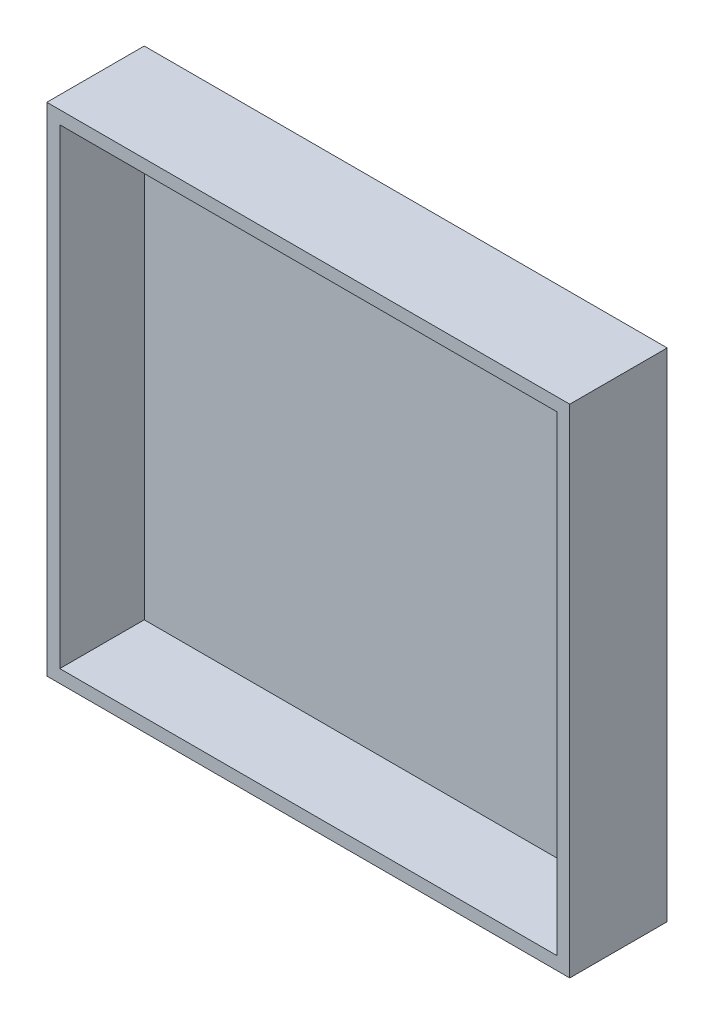
ISO-10303-21;
HEADER;
FILE_DESCRIPTION(('STEP AP214'),'2;1');
FILE_NAME('part.step','',(''),(''),'','','');
FILE_SCHEMA(('AUTOMOTIVE_DESIGN { 1 0 10303 214 1 1 1 1 }'));
ENDSEC;
DATA;
#1=APPLICATION_CONTEXT('core data for automotive mechanical design processes');
#2=APPLICATION_PROTOCOL_DEFINITION('international standard','automotive_design',2000,#1);
#3=PRODUCT_CONTEXT('',#1,'mechanical');
#4=PRODUCT('Part','Part','',(#3));
#5=PRODUCT_RELATED_PRODUCT_CATEGORY('part','',(#4));
#6=PRODUCT_DEFINITION_FORMATION('','',#4);
#7=PRODUCT_DEFINITION_CONTEXT('part definition',#1,'design');
#8=PRODUCT_DEFINITION('design','',#6,#7);
#9=PRODUCT_DEFINITION_SHAPE('','',#8);
#10=(LENGTH_UNIT() NAMED_UNIT(*) SI_UNIT(.MILLI.,.METRE.));
#11=(NAMED_UNIT(*) PLANE_ANGLE_UNIT() SI_UNIT($,.RADIAN.));
#12=(NAMED_UNIT(*) SI_UNIT($,.STERADIAN.) SOLID_ANGLE_UNIT());
#13=UNCERTAINTY_MEASURE_WITH_UNIT(LENGTH_MEASURE(1.E-05),#10,'distance_accuracy_value','');
#14=(GEOMETRIC_REPRESENTATION_CONTEXT(3) GLOBAL_UNCERTAINTY_ASSIGNED_CONTEXT((#13)) GLOBAL_UNIT_ASSIGNED_CONTEXT((#10,
#11,#12)) REPRESENTATION_CONTEXT('',''));
#15=CARTESIAN_POINT('',(0.,0.,0.));
#16=DIRECTION('',(0.,0.,1.));
#17=DIRECTION('',(1.,0.,0.));
#18=AXIS2_PLACEMENT_3D('',#15,#16,#17);
#19=CARTESIAN_POINT('',(-70.1385934908362,46.5557607090103,2.));
#20=DIRECTION('',(1.,0.,0.));
#21=DIRECTION('',(0.,1.,0.));
#22=AXIS2_PLACEMENT_3D('',#19,#20,#21);
#23=PLANE('',#22);
#24=DIRECTION('',(0.,-1.,0.));
#25=VECTOR('',#24,1.);
#26=CARTESIAN_POINT('',(-70.1385934908362,46.5557607090103,0.));
#27=LINE('',#26,#25);
#28=CARTESIAN_POINT('',(-70.1385934908362,46.5557607090103,0.));
#29=VERTEX_POINT('',#28);
#30=CARTESIAN_POINT('',(-70.1385934908361,-29.9442392909897,0.));
#31=VERTEX_POINT('',#30);
#32=EDGE_CURVE('E146',#29,#31,#27,.T.);
#33=ORIENTED_EDGE('',*,*,#32,.T.);
#34=DIRECTION('',(0.,0.,-1.));
#35=VECTOR('',#34,1.);
#36=CARTESIAN_POINT('',(-70.1385934908361,-29.9442392909897,2.));
#37=LINE('',#36,#35);
#38=CARTESIAN_POINT('',(-70.1385934908362,-29.9442392909897,15.));
#39=VERTEX_POINT('',#38);
#40=EDGE_CURVE('E11',#39,#31,#37,.T.);
#41=ORIENTED_EDGE('',*,*,#40,.F.);
#42=DIRECTION('',(0.,-1.,0.));
#43=VECTOR('',#42,1.);
#44=CARTESIAN_POINT('',(-70.1385934908362,46.5557607090103,15.));
#45=LINE('',#44,#43);
#46=CARTESIAN_POINT('',(-70.1385934908362,46.5557607090103,15.));
#47=VERTEX_POINT('',#46);
#48=EDGE_CURVE('E113',#47,#39,#45,.T.);
#49=ORIENTED_EDGE('',*,*,#48,.F.);
#50=DIRECTION('',(0.,0.,-1.));
#51=VECTOR('',#50,1.);
#52=CARTESIAN_POINT('',(-70.1385934908362,46.5557607090103,2.));
#53=LINE('',#52,#51);
#54=EDGE_CURVE('E155',#47,#29,#53,.T.);
#55=ORIENTED_EDGE('',*,*,#54,.T.);
#56=EDGE_LOOP('',(#33,#41,#49,#55));
#57=FACE_BOUND('',#56,.T.);
#58=ADVANCED_FACE('F35',(#57),#23,.F.);
#59=CARTESIAN_POINT('',(-70.1385934908361,-29.9442392909897,2.));
#60=DIRECTION('',(0.,1.,0.));
#61=DIRECTION('',(0.,0.,1.));
#62=AXIS2_PLACEMENT_3D('',#59,#60,#61);
#63=PLANE('',#62);
#64=DIRECTION('',(1.,0.,0.));
#65=VECTOR('',#64,1.);
#66=CARTESIAN_POINT('',(-70.1385934908361,-29.9442392909897,0.));
#67=LINE('',#66,#65);
#68=CARTESIAN_POINT('',(10.3614065091638,-29.9442392909897,0.));
#69=VERTEX_POINT('',#68);
#70=EDGE_CURVE('E149',#31,#69,#67,.T.);
#71=ORIENTED_EDGE('',*,*,#70,.T.);
#72=DIRECTION('',(0.,0.,-1.));
#73=VECTOR('',#72,1.);
#74=CARTESIAN_POINT('',(10.3614065091638,-29.9442392909897,2.));
#75=LINE('',#74,#73);
#76=CARTESIAN_POINT('',(10.3614065091638,-29.9442392909897,15.));
#77=VERTEX_POINT('',#76);
#78=EDGE_CURVE('E42',#77,#69,#75,.T.);
#79=ORIENTED_EDGE('',*,*,#78,.F.);
#80=DIRECTION('',(1.,0.,0.));
#81=VECTOR('',#80,1.);
#82=CARTESIAN_POINT('',(-70.1385934908362,-29.9442392909897,15.));
#83=LINE('',#82,#81);
#84=EDGE_CURVE('E137',#39,#77,#83,.T.);
#85=ORIENTED_EDGE('',*,*,#84,.F.);
#86=ORIENTED_EDGE('',*,*,#40,.T.);
#87=EDGE_LOOP('',(#71,#79,#85,#86));
#88=FACE_BOUND('',#87,.T.);
#89=ADVANCED_FACE('F177',(#88),#63,.F.);
#90=CARTESIAN_POINT('',(10.3614065091638,46.5557607090103,2.));
#91=DIRECTION('',(-1.,0.,0.));
#92=DIRECTION('',(0.,-1.,0.));
#93=AXIS2_PLACEMENT_3D('',#90,#91,#92);
#94=PLANE('',#93);
#95=DIRECTION('',(0.,1.,0.));
#96=VECTOR('',#95,1.);
#97=CARTESIAN_POINT('',(10.3614065091638,46.5557607090103,0.));
#98=LINE('',#97,#96);
#99=CARTESIAN_POINT('',(10.3614065091638,46.5557607090103,0.));
#100=VERTEX_POINT('',#99);
#101=EDGE_CURVE('E151',#69,#100,#98,.T.);
#102=ORIENTED_EDGE('',*,*,#101,.T.);
#103=DIRECTION('',(0.,0.,-1.));
#104=VECTOR('',#103,1.);
#105=CARTESIAN_POINT('',(10.3614065091638,46.5557607090103,2.));
#106=LINE('',#105,#104);
#107=CARTESIAN_POINT('',(10.3614065091638,46.5557607090103,15.));
#108=VERTEX_POINT('',#107);
#109=EDGE_CURVE('E158',#108,#100,#106,.T.);
#110=ORIENTED_EDGE('',*,*,#109,.F.);
#111=DIRECTION('',(0.,1.,0.));
#112=VECTOR('',#111,1.);
#113=CARTESIAN_POINT('',(10.3614065091638,46.5557607090103,15.));
#114=LINE('',#113,#112);
#115=EDGE_CURVE('E140',#77,#108,#114,.T.);
#116=ORIENTED_EDGE('',*,*,#115,.F.);
#117=ORIENTED_EDGE('',*,*,#78,.T.);
#118=EDGE_LOOP('',(#102,#110,#116,#117));
#119=FACE_BOUND('',#118,.T.);
#120=ADVANCED_FACE('F164',(#119),#94,.F.);
#121=CARTESIAN_POINT('',(-70.1385934908362,46.5557607090103,2.));
#122=DIRECTION('',(0.,-1.,0.));
#123=DIRECTION('',(0.,0.,-1.));
#124=AXIS2_PLACEMENT_3D('',#121,#122,#123);
#125=PLANE('',#124);
#126=DIRECTION('',(-1.,0.,0.));
#127=VECTOR('',#126,1.);
#128=CARTESIAN_POINT('',(-70.1385934908362,46.5557607090103,0.));
#129=LINE('',#128,#127);
#130=EDGE_CURVE('E153',#100,#29,#129,.T.);
#131=ORIENTED_EDGE('',*,*,#130,.T.);
#132=ORIENTED_EDGE('',*,*,#54,.F.);
#133=DIRECTION('',(-1.,0.,0.));
#134=VECTOR('',#133,1.);
#135=CARTESIAN_POINT('',(-70.1385934908362,46.5557607090103,15.));
#136=LINE('',#135,#134);
#137=EDGE_CURVE('E143',#108,#47,#136,.T.);
#138=ORIENTED_EDGE('',*,*,#137,.F.);
#139=ORIENTED_EDGE('',*,*,#109,.T.);
#140=EDGE_LOOP('',(#131,#132,#138,#139));
#141=FACE_BOUND('',#140,.T.);
#142=ADVANCED_FACE('F172',(#141),#125,.F.);
#143=CARTESIAN_POINT('',(0.,0.,0.));
#144=DIRECTION('',(0.,0.,1.));
#145=DIRECTION('',(1.,0.,0.));
#146=AXIS2_PLACEMENT_3D('',#143,#144,#145);
#147=PLANE('',#146);
#148=ORIENTED_EDGE('',*,*,#32,.F.);
#149=ORIENTED_EDGE('',*,*,#130,.F.);
#150=ORIENTED_EDGE('',*,*,#101,.F.);
#151=ORIENTED_EDGE('',*,*,#70,.F.);
#152=EDGE_LOOP('',(#148,#149,#150,#151));
#153=FACE_BOUND('',#152,.T.);
#154=ADVANCED_FACE('F170',(#153),#147,.F.);
#155=CARTESIAN_POINT('',(0.,0.,15.));
#156=DIRECTION('',(0.,0.,1.));
#157=DIRECTION('',(1.,0.,0.));
#158=AXIS2_PLACEMENT_3D('',#155,#156,#157);
#159=PLANE('',#158);
#160=ORIENTED_EDGE('',*,*,#48,.T.);
#161=ORIENTED_EDGE('',*,*,#84,.T.);
#162=ORIENTED_EDGE('',*,*,#115,.T.);
#163=ORIENTED_EDGE('',*,*,#137,.T.);
#164=EDGE_LOOP('',(#160,#161,#162,#163));
#165=FACE_BOUND('',#164,.T.);
#166=DIRECTION('',(1.,0.,0.));
#167=VECTOR('',#166,1.);
#168=CARTESIAN_POINT('',(-68.1385934908362,-27.9442392909897,15.));
#169=LINE('',#168,#167);
#170=CARTESIAN_POINT('',(-68.1385934908362,-27.9442392909897,15.));
#171=VERTEX_POINT('',#170);
#172=CARTESIAN_POINT('',(8.36140650916384,-27.9442392909897,15.));
#173=VERTEX_POINT('',#172);
#174=EDGE_CURVE('E107',#171,#173,#169,.T.);
#175=ORIENTED_EDGE('',*,*,#174,.F.);
#176=DIRECTION('',(0.,-1.,0.));
#177=VECTOR('',#176,1.);
#178=CARTESIAN_POINT('',(-68.1385934908362,44.5557607090103,15.));
#179=LINE('',#178,#177);
#180=CARTESIAN_POINT('',(-68.1385934908362,44.5557607090103,15.));
#181=VERTEX_POINT('',#180);
#182=EDGE_CURVE('E98',#181,#171,#179,.T.);
#183=ORIENTED_EDGE('',*,*,#182,.F.);
#184=DIRECTION('',(-1.,0.,0.));
#185=VECTOR('',#184,1.);
#186=CARTESIAN_POINT('',(-68.1385934908362,44.5557607090103,15.));
#187=LINE('',#186,#185);
#188=CARTESIAN_POINT('',(8.36140650916383,44.5557607090103,15.));
#189=VERTEX_POINT('',#188);
#190=EDGE_CURVE('E121',#189,#181,#187,.T.);
#191=ORIENTED_EDGE('',*,*,#190,.F.);
#192=DIRECTION('',(0.,1.,0.));
#193=VECTOR('',#192,1.);
#194=CARTESIAN_POINT('',(8.36140650916383,44.5557607090103,15.));
#195=LINE('',#194,#193);
#196=EDGE_CURVE('E119',#173,#189,#195,.T.);
#197=ORIENTED_EDGE('',*,*,#196,.F.);
#198=EDGE_LOOP('',(#175,#183,#191,#197));
#199=FACE_BOUND('',#198,.T.);
#200=ADVANCED_FACE('F117',(#165,#199),#159,.T.);
#201=CARTESIAN_POINT('',(-68.1385934908362,44.5557607090103,15.));
#202=DIRECTION('',(1.,0.,0.));
#203=DIRECTION('',(0.,1.,0.));
#204=AXIS2_PLACEMENT_3D('',#201,#202,#203);
#205=PLANE('',#204);
#206=DIRECTION('',(0.,-1.,0.));
#207=VECTOR('',#206,1.);
#208=CARTESIAN_POINT('',(-68.1385934908362,44.5557607090103,2.));
#209=LINE('',#208,#207);
#210=CARTESIAN_POINT('',(-68.1385934908362,44.5557607090103,2.));
#211=VERTEX_POINT('',#210);
#212=CARTESIAN_POINT('',(-68.1385934908362,-27.9442392909897,2.));
#213=VERTEX_POINT('',#212);
#214=EDGE_CURVE('E49',#211,#213,#209,.T.);
#215=ORIENTED_EDGE('',*,*,#214,.F.);
#216=DIRECTION('',(0.,0.,-1.));
#217=VECTOR('',#216,1.);
#218=CARTESIAN_POINT('',(-68.1385934908362,44.5557607090103,15.));
#219=LINE('',#218,#217);
#220=EDGE_CURVE('E103',#181,#211,#219,.T.);
#221=ORIENTED_EDGE('',*,*,#220,.F.);
#222=ORIENTED_EDGE('',*,*,#182,.T.);
#223=DIRECTION('',(0.,0.,-1.));
#224=VECTOR('',#223,1.);
#225=CARTESIAN_POINT('',(-68.1385934908362,-27.9442392909897,15.));
#226=LINE('',#225,#224);
#227=EDGE_CURVE('E101',#171,#213,#226,.T.);
#228=ORIENTED_EDGE('',*,*,#227,.T.);
#229=EDGE_LOOP('',(#215,#221,#222,#228));
#230=FACE_BOUND('',#229,.T.);
#231=ADVANCED_FACE('F100',(#230),#205,.T.);
#232=CARTESIAN_POINT('',(-68.1385934908362,-27.9442392909897,15.));
#233=DIRECTION('',(0.,1.,0.));
#234=DIRECTION('',(0.,0.,1.));
#235=AXIS2_PLACEMENT_3D('',#232,#233,#234);
#236=PLANE('',#235);
#237=DIRECTION('',(1.,0.,0.));
#238=VECTOR('',#237,1.);
#239=CARTESIAN_POINT('',(-68.1385934908362,-27.9442392909897,2.));
#240=LINE('',#239,#238);
#241=CARTESIAN_POINT('',(8.36140650916384,-27.9442392909897,2.));
#242=VERTEX_POINT('',#241);
#243=EDGE_CURVE('E53',#213,#242,#240,.T.);
#244=ORIENTED_EDGE('',*,*,#243,.F.);
#245=ORIENTED_EDGE('',*,*,#227,.F.);
#246=ORIENTED_EDGE('',*,*,#174,.T.);
#247=DIRECTION('',(0.,0.,-1.));
#248=VECTOR('',#247,1.);
#249=CARTESIAN_POINT('',(8.36140650916384,-27.9442392909897,15.));
#250=LINE('',#249,#248);
#251=EDGE_CURVE('E114',#173,#242,#250,.T.);
#252=ORIENTED_EDGE('',*,*,#251,.T.);
#253=EDGE_LOOP('',(#244,#245,#246,#252));
#254=FACE_BOUND('',#253,.T.);
#255=ADVANCED_FACE('F111',(#254),#236,.T.);
#256=CARTESIAN_POINT('',(8.36140650916383,44.5557607090103,15.));
#257=DIRECTION('',(-1.,0.,0.));
#258=DIRECTION('',(0.,-1.,0.));
#259=AXIS2_PLACEMENT_3D('',#256,#257,#258);
#260=PLANE('',#259);
#261=DIRECTION('',(0.,1.,0.));
#262=VECTOR('',#261,1.);
#263=CARTESIAN_POINT('',(8.36140650916383,44.5557607090103,2.));
#264=LINE('',#263,#262);
#265=CARTESIAN_POINT('',(8.36140650916383,44.5557607090103,2.));
#266=VERTEX_POINT('',#265);
#267=EDGE_CURVE('E127',#242,#266,#264,.T.);
#268=ORIENTED_EDGE('',*,*,#267,.F.);
#269=ORIENTED_EDGE('',*,*,#251,.F.);
#270=ORIENTED_EDGE('',*,*,#196,.T.);
#271=DIRECTION('',(0.,0.,-1.));
#272=VECTOR('',#271,1.);
#273=CARTESIAN_POINT('',(8.36140650916383,44.5557607090103,15.));
#274=LINE('',#273,#272);
#275=EDGE_CURVE('E131',#189,#266,#274,.T.);
#276=ORIENTED_EDGE('',*,*,#275,.T.);
#277=EDGE_LOOP('',(#268,#269,#270,#276));
#278=FACE_BOUND('',#277,.T.);
#279=ADVANCED_FACE('F199',(#278),#260,.T.);
#280=CARTESIAN_POINT('',(-68.1385934908362,44.5557607090103,15.));
#281=DIRECTION('',(0.,-1.,0.));
#282=DIRECTION('',(0.,0.,-1.));
#283=AXIS2_PLACEMENT_3D('',#280,#281,#282);
#284=PLANE('',#283);
#285=DIRECTION('',(-1.,0.,0.));
#286=VECTOR('',#285,1.);
#287=CARTESIAN_POINT('',(-68.1385934908362,44.5557607090103,2.));
#288=LINE('',#287,#286);
#289=EDGE_CURVE('E108',#266,#211,#288,.T.);
#290=ORIENTED_EDGE('',*,*,#289,.F.);
#291=ORIENTED_EDGE('',*,*,#275,.F.);
#292=ORIENTED_EDGE('',*,*,#190,.T.);
#293=ORIENTED_EDGE('',*,*,#220,.T.);
#294=EDGE_LOOP('',(#290,#291,#292,#293));
#295=FACE_BOUND('',#294,.T.);
#296=ADVANCED_FACE('F192',(#295),#284,.T.);
#297=CARTESIAN_POINT('',(0.,0.,2.));
#298=DIRECTION('',(0.,0.,1.));
#299=DIRECTION('',(1.,0.,0.));
#300=AXIS2_PLACEMENT_3D('',#297,#298,#299);
#301=PLANE('',#300);
#302=ORIENTED_EDGE('',*,*,#214,.T.);
#303=ORIENTED_EDGE('',*,*,#243,.T.);
#304=ORIENTED_EDGE('',*,*,#267,.T.);
#305=ORIENTED_EDGE('',*,*,#289,.T.);
#306=EDGE_LOOP('',(#302,#303,#304,#305));
#307=FACE_BOUND('',#306,.T.);
#308=ADVANCED_FACE('F189',(#307),#301,.T.);
#309=CLOSED_SHELL('',(#58,#89,#120,#142,#154,#200,#231,#255,#279,#296,#308));
#310=MANIFOLD_SOLID_BREP('B2',#309);
#311=ADVANCED_BREP_SHAPE_REPRESENTATION('',(#18,#310),#14);
#312=SHAPE_DEFINITION_REPRESENTATION(#9,#311);
ENDSEC;
END-ISO-10303-21;
